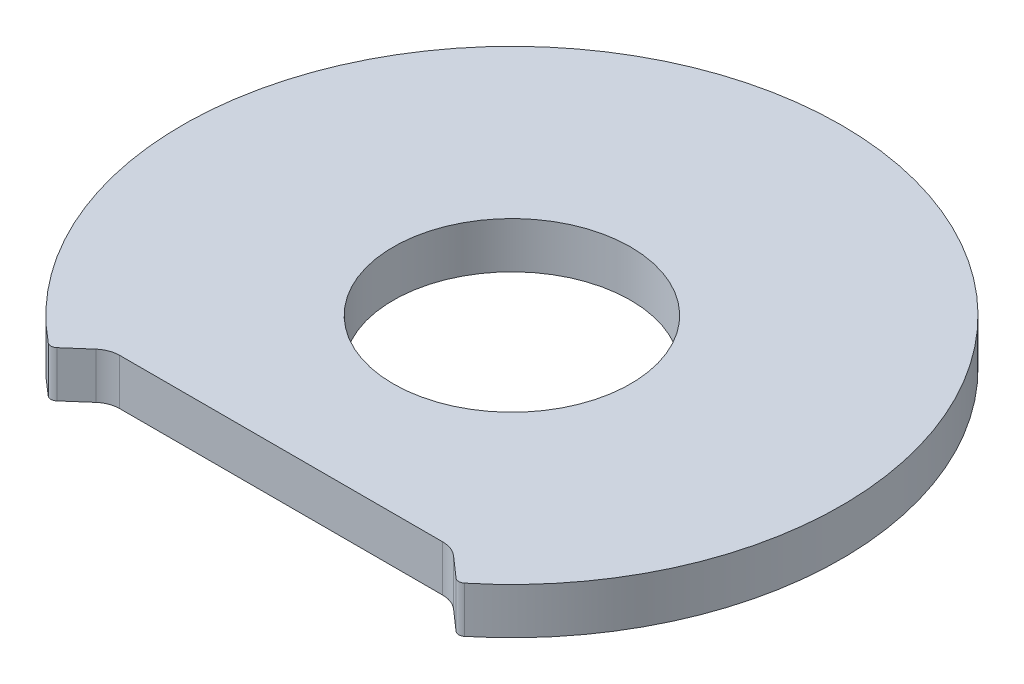
ISO-10303-21;
HEADER;
FILE_DESCRIPTION(('STEP AP214'),'2;1');
FILE_NAME('part.step','',(''),(''),'','','');
FILE_SCHEMA(('AUTOMOTIVE_DESIGN { 1 0 10303 214 1 1 1 1 }'));
ENDSEC;
DATA;
#1=APPLICATION_CONTEXT('core data for automotive mechanical design processes');
#2=APPLICATION_PROTOCOL_DEFINITION('international standard','automotive_design',2000,#1);
#3=PRODUCT_CONTEXT('',#1,'mechanical');
#4=PRODUCT('Part','Part','',(#3));
#5=PRODUCT_RELATED_PRODUCT_CATEGORY('part','',(#4));
#6=PRODUCT_DEFINITION_FORMATION('','',#4);
#7=PRODUCT_DEFINITION_CONTEXT('part definition',#1,'design');
#8=PRODUCT_DEFINITION('design','',#6,#7);
#9=PRODUCT_DEFINITION_SHAPE('','',#8);
#10=(LENGTH_UNIT() NAMED_UNIT(*) SI_UNIT(.MILLI.,.METRE.));
#11=(NAMED_UNIT(*) PLANE_ANGLE_UNIT() SI_UNIT($,.RADIAN.));
#12=(NAMED_UNIT(*) SI_UNIT($,.STERADIAN.) SOLID_ANGLE_UNIT());
#13=UNCERTAINTY_MEASURE_WITH_UNIT(LENGTH_MEASURE(1.E-05),#10,'distance_accuracy_value','');
#14=(GEOMETRIC_REPRESENTATION_CONTEXT(3) GLOBAL_UNCERTAINTY_ASSIGNED_CONTEXT((#13)) GLOBAL_UNIT_ASSIGNED_CONTEXT((#10,
#11,#12)) REPRESENTATION_CONTEXT('',''));
#15=CARTESIAN_POINT('',(0.,0.,0.));
#16=DIRECTION('',(0.,0.,1.));
#17=DIRECTION('',(1.,0.,0.));
#18=AXIS2_PLACEMENT_3D('',#15,#16,#17);
#19=CARTESIAN_POINT('',(24.5,7.,39.));
#20=DIRECTION('',(0.,-1.,0.));
#21=DIRECTION('',(0.,0.,-1.));
#22=AXIS2_PLACEMENT_3D('',#19,#20,#21);
#23=PLANE('',#22);
#24=CARTESIAN_POINT('',(24.5,7.,39.));
#25=DIRECTION('',(0.,-1.,0.));
#26=DIRECTION('',(0.,0.,-1.));
#27=AXIS2_PLACEMENT_3D('',#24,#25,#26);
#28=CIRCLE('',#27,4.);
#29=CARTESIAN_POINT('',(24.5,7.,35.));
#30=VERTEX_POINT('',#29);
#31=CARTESIAN_POINT('',(27.1409786163443,7.,35.9957976186661));
#32=VERTEX_POINT('',#31);
#33=EDGE_CURVE('E164',#30,#32,#28,.T.);
#34=ORIENTED_EDGE('',*,*,#33,.T.);
#35=DIRECTION('',(0.751050595333467,0.,0.660244654086078));
#36=VECTOR('',#35,1.);
#37=CARTESIAN_POINT('',(27.1409786163443,7.,35.9957976186661));
#38=LINE('',#37,#36);
#39=CARTESIAN_POINT('',(30.27517194243,7.,38.7510505953335));
#40=VERTEX_POINT('',#39);
#41=EDGE_CURVE('E100',#32,#40,#38,.T.);
#42=ORIENTED_EDGE('',*,*,#41,.T.);
#43=CARTESIAN_POINT('',(30.9354165965161,7.,38.));
#44=DIRECTION('',(0.,1.,0.));
#45=DIRECTION('',(0.,0.,1.));
#46=AXIS2_PLACEMENT_3D('',#43,#44,#45);
#47=CIRCLE('',#46,1.);
#48=CARTESIAN_POINT('',(31.566751629098,7.,38.7755102040816));
#49=VERTEX_POINT('',#48);
#50=EDGE_CURVE('E185',#40,#49,#47,.T.);
#51=ORIENTED_EDGE('',*,*,#50,.T.);
#52=CARTESIAN_POINT('',(0.,7.,0.));
#53=DIRECTION('',(0.,1.,0.));
#54=DIRECTION('',(0.,0.,1.));
#55=AXIS2_PLACEMENT_3D('',#52,#53,#54);
#56=CIRCLE('',#55,50.);
#57=CARTESIAN_POINT('',(-31.566751629098,7.,38.7755102040816));
#58=VERTEX_POINT('',#57);
#59=EDGE_CURVE('E199',#49,#58,#56,.T.);
#60=ORIENTED_EDGE('',*,*,#59,.T.);
#61=CARTESIAN_POINT('',(-30.935416596516,7.,38.));
#62=DIRECTION('',(0.,1.,0.));
#63=DIRECTION('',(0.,0.,-1.));
#64=AXIS2_PLACEMENT_3D('',#61,#62,#63);
#65=CIRCLE('',#64,0.999999999999999);
#66=CARTESIAN_POINT('',(-30.27517194243,7.,38.7510505953335));
#67=VERTEX_POINT('',#66);
#68=EDGE_CURVE('E119',#58,#67,#65,.T.);
#69=ORIENTED_EDGE('',*,*,#68,.T.);
#70=DIRECTION('',(0.751050595333467,0.,-0.660244654086078));
#71=VECTOR('',#70,1.);
#72=CARTESIAN_POINT('',(-27.1409786163443,7.,35.9957976186661));
#73=LINE('',#72,#71);
#74=CARTESIAN_POINT('',(-27.1409786163443,7.,35.9957976186661));
#75=VERTEX_POINT('',#74);
#76=EDGE_CURVE('E113',#67,#75,#73,.T.);
#77=ORIENTED_EDGE('',*,*,#76,.T.);
#78=CARTESIAN_POINT('',(-24.5,7.,39.));
#79=DIRECTION('',(0.,-1.,0.));
#80=DIRECTION('',(0.,0.,1.));
#81=AXIS2_PLACEMENT_3D('',#78,#79,#80);
#82=CIRCLE('',#81,4.);
#83=CARTESIAN_POINT('',(-24.5,7.,35.));
#84=VERTEX_POINT('',#83);
#85=EDGE_CURVE('E117',#75,#84,#82,.T.);
#86=ORIENTED_EDGE('',*,*,#85,.T.);
#87=DIRECTION('',(1.,0.,0.));
#88=VECTOR('',#87,1.);
#89=CARTESIAN_POINT('',(24.5,7.,35.));
#90=LINE('',#89,#88);
#91=EDGE_CURVE('E57',#84,#30,#90,.T.);
#92=ORIENTED_EDGE('',*,*,#91,.T.);
#93=EDGE_LOOP('',(#34,#42,#51,#60,#69,#77,#86,#92));
#94=FACE_BOUND('',#93,.T.);
#95=CARTESIAN_POINT('',(0.,7.,0.));
#96=DIRECTION('',(0.,1.,0.));
#97=DIRECTION('',(0.,0.,1.));
#98=AXIS2_PLACEMENT_3D('',#95,#96,#97);
#99=CIRCLE('',#98,18.);
#100=CARTESIAN_POINT('',(0.,7.,18.));
#101=VERTEX_POINT('',#100);
#102=EDGE_CURVE('E146',#101,#101,#99,.T.);
#103=ORIENTED_EDGE('',*,*,#102,.F.);
#104=EDGE_LOOP('',(#103));
#105=FACE_BOUND('',#104,.T.);
#106=ADVANCED_FACE('F39',(#94,#105),#23,.F.);
#107=CARTESIAN_POINT('',(24.5,0.,39.));
#108=DIRECTION('',(0.,-1.,0.));
#109=DIRECTION('',(0.,0.,-1.));
#110=AXIS2_PLACEMENT_3D('',#107,#108,#109);
#111=PLANE('',#110);
#112=CARTESIAN_POINT('',(24.5,0.,39.));
#113=DIRECTION('',(0.,-1.,0.));
#114=DIRECTION('',(0.,0.,-1.));
#115=AXIS2_PLACEMENT_3D('',#112,#113,#114);
#116=CIRCLE('',#115,4.);
#117=CARTESIAN_POINT('',(24.5,0.,35.));
#118=VERTEX_POINT('',#117);
#119=CARTESIAN_POINT('',(27.1409786163443,0.,35.9957976186661));
#120=VERTEX_POINT('',#119);
#121=EDGE_CURVE('E141',#118,#120,#116,.T.);
#122=ORIENTED_EDGE('',*,*,#121,.F.);
#123=DIRECTION('',(1.,0.,0.));
#124=VECTOR('',#123,1.);
#125=CARTESIAN_POINT('',(24.5,0.,35.));
#126=LINE('',#125,#124);
#127=CARTESIAN_POINT('',(-24.5,0.,35.));
#128=VERTEX_POINT('',#127);
#129=EDGE_CURVE('E92',#128,#118,#126,.T.);
#130=ORIENTED_EDGE('',*,*,#129,.F.);
#131=CARTESIAN_POINT('',(-24.5,0.,39.));
#132=DIRECTION('',(0.,-1.,0.));
#133=DIRECTION('',(0.,0.,1.));
#134=AXIS2_PLACEMENT_3D('',#131,#132,#133);
#135=CIRCLE('',#134,4.);
#136=CARTESIAN_POINT('',(-27.1409786163443,0.,35.9957976186661));
#137=VERTEX_POINT('',#136);
#138=EDGE_CURVE('E86',#137,#128,#135,.T.);
#139=ORIENTED_EDGE('',*,*,#138,.F.);
#140=DIRECTION('',(0.751050595333467,0.,-0.660244654086078));
#141=VECTOR('',#140,1.);
#142=CARTESIAN_POINT('',(-27.1409786163443,0.,35.9957976186661));
#143=LINE('',#142,#141);
#144=CARTESIAN_POINT('',(-30.27517194243,0.,38.7510505953335));
#145=VERTEX_POINT('',#144);
#146=EDGE_CURVE('E128',#145,#137,#143,.T.);
#147=ORIENTED_EDGE('',*,*,#146,.F.);
#148=CARTESIAN_POINT('',(-30.935416596516,0.,38.));
#149=DIRECTION('',(0.,1.,0.));
#150=DIRECTION('',(0.,0.,-1.));
#151=AXIS2_PLACEMENT_3D('',#148,#149,#150);
#152=CIRCLE('',#151,0.999999999999999);
#153=CARTESIAN_POINT('',(-31.566751629098,0.,38.7755102040816));
#154=VERTEX_POINT('',#153);
#155=EDGE_CURVE('E155',#154,#145,#152,.T.);
#156=ORIENTED_EDGE('',*,*,#155,.F.);
#157=CARTESIAN_POINT('',(0.,0.,0.));
#158=DIRECTION('',(0.,1.,0.));
#159=DIRECTION('',(0.,0.,1.));
#160=AXIS2_PLACEMENT_3D('',#157,#158,#159);
#161=CIRCLE('',#160,50.);
#162=CARTESIAN_POINT('',(31.566751629098,0.,38.7755102040816));
#163=VERTEX_POINT('',#162);
#164=EDGE_CURVE('E152',#163,#154,#161,.T.);
#165=ORIENTED_EDGE('',*,*,#164,.F.);
#166=CARTESIAN_POINT('',(30.9354165965161,0.,38.));
#167=DIRECTION('',(0.,1.,0.));
#168=DIRECTION('',(0.,0.,1.));
#169=AXIS2_PLACEMENT_3D('',#166,#167,#168);
#170=CIRCLE('',#169,1.);
#171=CARTESIAN_POINT('',(30.27517194243,0.,38.7510505953335));
#172=VERTEX_POINT('',#171);
#173=EDGE_CURVE('E149',#172,#163,#170,.T.);
#174=ORIENTED_EDGE('',*,*,#173,.F.);
#175=DIRECTION('',(0.751050595333467,0.,0.660244654086078));
#176=VECTOR('',#175,1.);
#177=CARTESIAN_POINT('',(27.1409786163443,0.,35.9957976186661));
#178=LINE('',#177,#176);
#179=EDGE_CURVE('E145',#120,#172,#178,.T.);
#180=ORIENTED_EDGE('',*,*,#179,.F.);
#181=EDGE_LOOP('',(#122,#130,#139,#147,#156,#165,#174,#180));
#182=FACE_BOUND('',#181,.T.);
#183=CARTESIAN_POINT('',(0.,0.,0.));
#184=DIRECTION('',(0.,1.,0.));
#185=DIRECTION('',(0.,0.,1.));
#186=AXIS2_PLACEMENT_3D('',#183,#184,#185);
#187=CIRCLE('',#186,18.);
#188=CARTESIAN_POINT('',(0.,0.,18.));
#189=VERTEX_POINT('',#188);
#190=EDGE_CURVE('E209',#189,#189,#187,.T.);
#191=ORIENTED_EDGE('',*,*,#190,.T.);
#192=EDGE_LOOP('',(#191));
#193=FACE_BOUND('',#192,.T.);
#194=ADVANCED_FACE('F189',(#182,#193),#111,.T.);
#195=CARTESIAN_POINT('',(24.5,7.,39.));
#196=DIRECTION('',(0.,-1.,0.));
#197=DIRECTION('',(0.,0.,-1.));
#198=AXIS2_PLACEMENT_3D('',#195,#196,#197);
#199=CYLINDRICAL_SURFACE('',#198,4.);
#200=ORIENTED_EDGE('',*,*,#121,.T.);
#201=DIRECTION('',(0.,-1.,0.));
#202=VECTOR('',#201,1.);
#203=CARTESIAN_POINT('',(27.1409786163443,7.,35.9957976186661));
#204=LINE('',#203,#202);
#205=EDGE_CURVE('E11',#32,#120,#204,.T.);
#206=ORIENTED_EDGE('',*,*,#205,.F.);
#207=ORIENTED_EDGE('',*,*,#33,.F.);
#208=DIRECTION('',(0.,-1.,0.));
#209=VECTOR('',#208,1.);
#210=CARTESIAN_POINT('',(24.5,7.,35.));
#211=LINE('',#210,#209);
#212=EDGE_CURVE('E137',#30,#118,#211,.T.);
#213=ORIENTED_EDGE('',*,*,#212,.T.);
#214=EDGE_LOOP('',(#200,#206,#207,#213));
#215=FACE_BOUND('',#214,.T.);
#216=ADVANCED_FACE('F41',(#215),#199,.F.);
#217=CARTESIAN_POINT('',(27.1409786163443,7.,35.9957976186661));
#218=DIRECTION('',(0.660244654086078,0.,-0.751050595333467));
#219=DIRECTION('',(-0.751050595333467,0.,-0.660244654086078));
#220=AXIS2_PLACEMENT_3D('',#217,#218,#219);
#221=PLANE('',#220);
#222=ORIENTED_EDGE('',*,*,#179,.T.);
#223=DIRECTION('',(0.,-1.,0.));
#224=VECTOR('',#223,1.);
#225=CARTESIAN_POINT('',(30.27517194243,7.,38.7510505953335));
#226=LINE('',#225,#224);
#227=EDGE_CURVE('E49',#40,#172,#226,.T.);
#228=ORIENTED_EDGE('',*,*,#227,.F.);
#229=ORIENTED_EDGE('',*,*,#41,.F.);
#230=ORIENTED_EDGE('',*,*,#205,.T.);
#231=EDGE_LOOP('',(#222,#228,#229,#230));
#232=FACE_BOUND('',#231,.T.);
#233=ADVANCED_FACE('F239',(#232),#221,.F.);
#234=CARTESIAN_POINT('',(30.9354165965161,7.,38.));
#235=DIRECTION('',(0.,-1.,0.));
#236=DIRECTION('',(0.,0.,-1.));
#237=AXIS2_PLACEMENT_3D('',#234,#235,#236);
#238=CYLINDRICAL_SURFACE('',#237,1.);
#239=ORIENTED_EDGE('',*,*,#173,.T.);
#240=DIRECTION('',(0.,-1.,0.));
#241=VECTOR('',#240,1.);
#242=CARTESIAN_POINT('',(31.566751629098,7.,38.7755102040816));
#243=LINE('',#242,#241);
#244=EDGE_CURVE('E175',#49,#163,#243,.T.);
#245=ORIENTED_EDGE('',*,*,#244,.F.);
#246=ORIENTED_EDGE('',*,*,#50,.F.);
#247=ORIENTED_EDGE('',*,*,#227,.T.);
#248=EDGE_LOOP('',(#239,#245,#246,#247));
#249=FACE_BOUND('',#248,.T.);
#250=ADVANCED_FACE('F183',(#249),#238,.T.);
#251=CARTESIAN_POINT('',(0.,7.,0.));
#252=DIRECTION('',(0.,-1.,0.));
#253=DIRECTION('',(0.,0.,-1.));
#254=AXIS2_PLACEMENT_3D('',#251,#252,#253);
#255=CYLINDRICAL_SURFACE('',#254,50.);
#256=ORIENTED_EDGE('',*,*,#164,.T.);
#257=DIRECTION('',(0.,-1.,0.));
#258=VECTOR('',#257,1.);
#259=CARTESIAN_POINT('',(-31.566751629098,7.,38.7755102040816));
#260=LINE('',#259,#258);
#261=EDGE_CURVE('E171',#58,#154,#260,.T.);
#262=ORIENTED_EDGE('',*,*,#261,.F.);
#263=ORIENTED_EDGE('',*,*,#59,.F.);
#264=ORIENTED_EDGE('',*,*,#244,.T.);
#265=EDGE_LOOP('',(#256,#262,#263,#264));
#266=FACE_BOUND('',#265,.T.);
#267=ADVANCED_FACE('F194',(#266),#255,.T.);
#268=CARTESIAN_POINT('',(-30.935416596516,7.,38.));
#269=DIRECTION('',(0.,-1.,0.));
#270=DIRECTION('',(0.,0.,-1.));
#271=AXIS2_PLACEMENT_3D('',#268,#269,#270);
#272=CYLINDRICAL_SURFACE('',#271,0.999999999999999);
#273=ORIENTED_EDGE('',*,*,#155,.T.);
#274=DIRECTION('',(0.,-1.,0.));
#275=VECTOR('',#274,1.);
#276=CARTESIAN_POINT('',(-30.27517194243,7.,38.7510505953335));
#277=LINE('',#276,#275);
#278=EDGE_CURVE('E130',#67,#145,#277,.T.);
#279=ORIENTED_EDGE('',*,*,#278,.F.);
#280=ORIENTED_EDGE('',*,*,#68,.F.);
#281=ORIENTED_EDGE('',*,*,#261,.T.);
#282=EDGE_LOOP('',(#273,#279,#280,#281));
#283=FACE_BOUND('',#282,.T.);
#284=ADVANCED_FACE('F197',(#283),#272,.T.);
#285=CARTESIAN_POINT('',(-27.1409786163443,7.,35.9957976186661));
#286=DIRECTION('',(-0.660244654086078,0.,-0.751050595333467));
#287=DIRECTION('',(-0.751050595333467,0.,0.660244654086078));
#288=AXIS2_PLACEMENT_3D('',#285,#286,#287);
#289=PLANE('',#288);
#290=ORIENTED_EDGE('',*,*,#146,.T.);
#291=DIRECTION('',(0.,-1.,0.));
#292=VECTOR('',#291,1.);
#293=CARTESIAN_POINT('',(-27.1409786163443,7.,35.9957976186661));
#294=LINE('',#293,#292);
#295=EDGE_CURVE('E125',#75,#137,#294,.T.);
#296=ORIENTED_EDGE('',*,*,#295,.F.);
#297=ORIENTED_EDGE('',*,*,#76,.F.);
#298=ORIENTED_EDGE('',*,*,#278,.T.);
#299=EDGE_LOOP('',(#290,#296,#297,#298));
#300=FACE_BOUND('',#299,.T.);
#301=ADVANCED_FACE('F126',(#300),#289,.F.);
#302=CARTESIAN_POINT('',(-24.5,7.,39.));
#303=DIRECTION('',(0.,-1.,0.));
#304=DIRECTION('',(0.,0.,-1.));
#305=AXIS2_PLACEMENT_3D('',#302,#303,#304);
#306=CYLINDRICAL_SURFACE('',#305,4.);
#307=ORIENTED_EDGE('',*,*,#138,.T.);
#308=DIRECTION('',(0.,-1.,0.));
#309=VECTOR('',#308,1.);
#310=CARTESIAN_POINT('',(-24.5,7.,35.));
#311=LINE('',#310,#309);
#312=EDGE_CURVE('E131',#84,#128,#311,.T.);
#313=ORIENTED_EDGE('',*,*,#312,.F.);
#314=ORIENTED_EDGE('',*,*,#85,.F.);
#315=ORIENTED_EDGE('',*,*,#295,.T.);
#316=EDGE_LOOP('',(#307,#313,#314,#315));
#317=FACE_BOUND('',#316,.T.);
#318=ADVANCED_FACE('F133',(#317),#306,.F.);
#319=CARTESIAN_POINT('',(24.5,7.,35.));
#320=DIRECTION('',(0.,0.,-1.));
#321=DIRECTION('',(-1.,0.,0.));
#322=AXIS2_PLACEMENT_3D('',#319,#320,#321);
#323=PLANE('',#322);
#324=ORIENTED_EDGE('',*,*,#129,.T.);
#325=ORIENTED_EDGE('',*,*,#212,.F.);
#326=ORIENTED_EDGE('',*,*,#91,.F.);
#327=ORIENTED_EDGE('',*,*,#312,.T.);
#328=EDGE_LOOP('',(#324,#325,#326,#327));
#329=FACE_BOUND('',#328,.T.);
#330=ADVANCED_FACE('F227',(#329),#323,.F.);
#331=CARTESIAN_POINT('',(0.,7.,0.));
#332=DIRECTION('',(0.,-1.,0.));
#333=DIRECTION('',(0.,0.,-1.));
#334=AXIS2_PLACEMENT_3D('',#331,#332,#333);
#335=CYLINDRICAL_SURFACE('',#334,18.);
#336=ORIENTED_EDGE('',*,*,#102,.T.);
#337=EDGE_LOOP('',(#336));
#338=FACE_BOUND('',#337,.T.);
#339=ORIENTED_EDGE('',*,*,#190,.F.);
#340=EDGE_LOOP('',(#339));
#341=FACE_BOUND('',#340,.T.);
#342=ADVANCED_FACE('F217',(#338,#341),#335,.F.);
#343=CLOSED_SHELL('',(#106,#194,#216,#233,#250,#267,#284,#301,#318,#330,#342));
#344=MANIFOLD_SOLID_BREP('B2',#343);
#345=ADVANCED_BREP_SHAPE_REPRESENTATION('',(#18,#344),#14);
#346=SHAPE_DEFINITION_REPRESENTATION(#9,#345);
ENDSEC;
END-ISO-10303-21;
